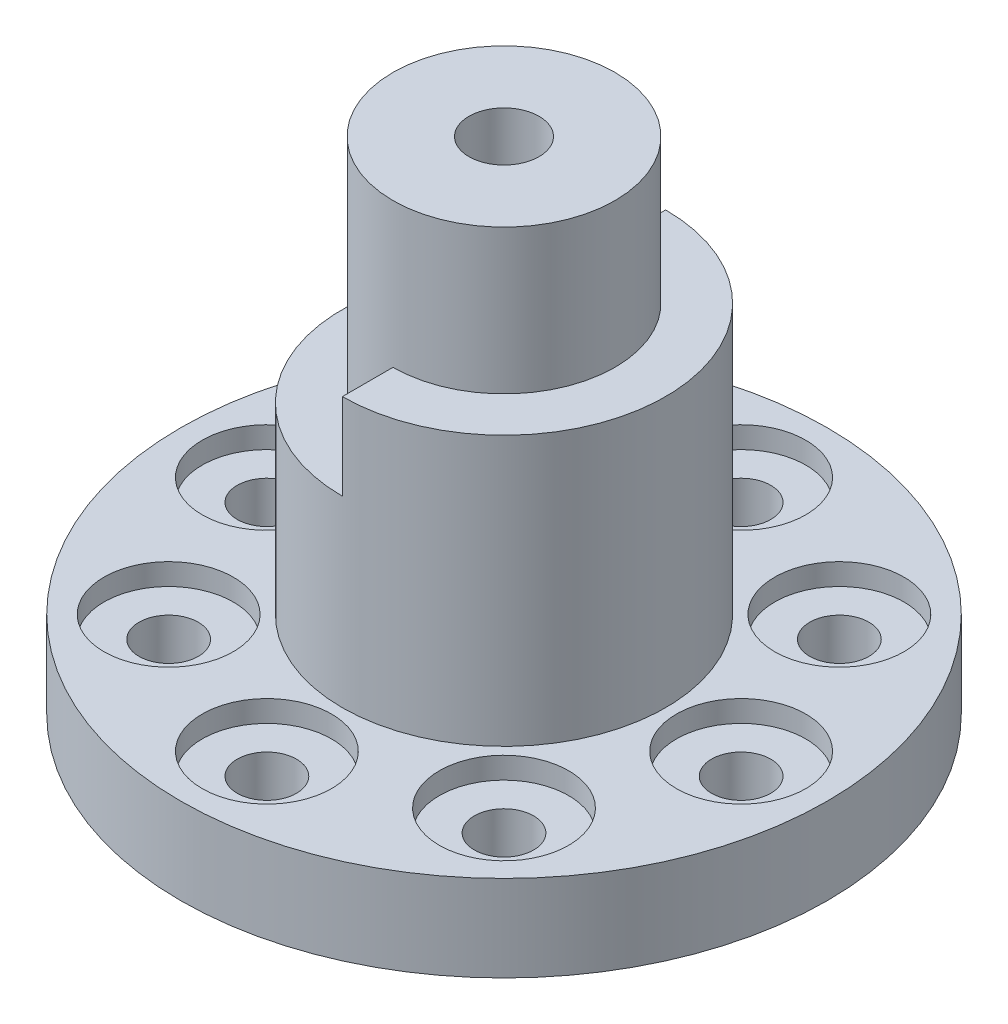
ISO-10303-21;
HEADER;
FILE_DESCRIPTION(('STEP AP214'),'2;1');
FILE_NAME('part.step','',(''),(''),'','','');
FILE_SCHEMA(('AUTOMOTIVE_DESIGN { 1 0 10303 214 1 1 1 1 }'));
ENDSEC;
DATA;
#1=APPLICATION_CONTEXT('core data for automotive mechanical design processes');
#2=APPLICATION_PROTOCOL_DEFINITION('international standard','automotive_design',2000,#1);
#3=PRODUCT_CONTEXT('',#1,'mechanical');
#4=PRODUCT('Part','Part','',(#3));
#5=PRODUCT_RELATED_PRODUCT_CATEGORY('part','',(#4));
#6=PRODUCT_DEFINITION_FORMATION('','',#4);
#7=PRODUCT_DEFINITION_CONTEXT('part definition',#1,'design');
#8=PRODUCT_DEFINITION('design','',#6,#7);
#9=PRODUCT_DEFINITION_SHAPE('','',#8);
#10=(LENGTH_UNIT() NAMED_UNIT(*) SI_UNIT(.MILLI.,.METRE.));
#11=(NAMED_UNIT(*) PLANE_ANGLE_UNIT() SI_UNIT($,.RADIAN.));
#12=(NAMED_UNIT(*) SI_UNIT($,.STERADIAN.) SOLID_ANGLE_UNIT());
#13=UNCERTAINTY_MEASURE_WITH_UNIT(LENGTH_MEASURE(1.E-05),#10,'distance_accuracy_value','');
#14=(GEOMETRIC_REPRESENTATION_CONTEXT(3) GLOBAL_UNCERTAINTY_ASSIGNED_CONTEXT((#13)) GLOBAL_UNIT_ASSIGNED_CONTEXT((#10,
#11,#12)) REPRESENTATION_CONTEXT('',''));
#15=CARTESIAN_POINT('',(0.,0.,0.));
#16=DIRECTION('',(0.,0.,1.));
#17=DIRECTION('',(1.,0.,0.));
#18=AXIS2_PLACEMENT_3D('',#15,#16,#17);
#19=CARTESIAN_POINT('',(0.,5.,0.));
#20=DIRECTION('',(0.,1.,0.));
#21=DIRECTION('',(0.,0.,1.));
#22=AXIS2_PLACEMENT_3D('',#19,#20,#21);
#23=PLANE('',#22);
#24=DIRECTION('',(0.,0.,1.));
#25=VECTOR('',#24,1.);
#26=CARTESIAN_POINT('',(0.,5.,0.));
#27=LINE('',#26,#25);
#28=CARTESIAN_POINT('',(0.,5.,-7.5));
#29=VERTEX_POINT('',#28);
#30=CARTESIAN_POINT('',(0.,5.,-5.15));
#31=VERTEX_POINT('',#30);
#32=EDGE_CURVE('E233',#29,#31,#27,.T.);
#33=ORIENTED_EDGE('',*,*,#32,.F.);
#34=CARTESIAN_POINT('',(0.,5.,0.));
#35=DIRECTION('',(0.,1.,0.));
#36=DIRECTION('',(0.,0.,1.));
#37=AXIS2_PLACEMENT_3D('',#34,#35,#36);
#38=CIRCLE('',#37,7.5);
#39=CARTESIAN_POINT('',(0.,5.,7.5));
#40=VERTEX_POINT('',#39);
#41=EDGE_CURVE('E105',#29,#40,#38,.T.);
#42=ORIENTED_EDGE('',*,*,#41,.T.);
#43=CARTESIAN_POINT('',(0.,5.,5.15));
#44=VERTEX_POINT('',#43);
#45=EDGE_CURVE('E58',#44,#40,#27,.T.);
#46=ORIENTED_EDGE('',*,*,#45,.F.);
#47=CARTESIAN_POINT('',(0.,5.,0.));
#48=DIRECTION('',(0.,1.,0.));
#49=DIRECTION('',(0.,0.,1.));
#50=AXIS2_PLACEMENT_3D('',#47,#48,#49);
#51=CIRCLE('',#50,5.15);
#52=EDGE_CURVE('E11',#44,#31,#51,.F.);
#53=ORIENTED_EDGE('',*,*,#52,.T.);
#54=EDGE_LOOP('',(#33,#42,#46,#53));
#55=FACE_BOUND('',#54,.T.);
#56=ADVANCED_FACE('F41',(#55),#23,.T.);
#57=CARTESIAN_POINT('',(0.,9.,0.));
#58=DIRECTION('',(1.,0.,0.));
#59=DIRECTION('',(0.,0.,-1.));
#60=AXIS2_PLACEMENT_3D('',#57,#58,#59);
#61=PLANE('',#60);
#62=DIRECTION('',(0.,0.,1.));
#63=VECTOR('',#62,1.);
#64=CARTESIAN_POINT('',(0.,9.,0.));
#65=LINE('',#64,#63);
#66=CARTESIAN_POINT('',(0.,9.,-7.5));
#67=VERTEX_POINT('',#66);
#68=CARTESIAN_POINT('',(0.,9.,-5.15));
#69=VERTEX_POINT('',#68);
#70=EDGE_CURVE('E66',#67,#69,#65,.T.);
#71=ORIENTED_EDGE('',*,*,#70,.F.);
#72=DIRECTION('',(0.,-1.,0.));
#73=VECTOR('',#72,1.);
#74=CARTESIAN_POINT('',(0.,9.,-7.5));
#75=LINE('',#74,#73);
#76=EDGE_CURVE('E86',#67,#29,#75,.T.);
#77=ORIENTED_EDGE('',*,*,#76,.T.);
#78=ORIENTED_EDGE('',*,*,#32,.T.);
#79=DIRECTION('',(0.,-1.,0.));
#80=VECTOR('',#79,1.);
#81=CARTESIAN_POINT('',(0.,9.,-5.15));
#82=LINE('',#81,#80);
#83=EDGE_CURVE('E88',#69,#31,#82,.T.);
#84=ORIENTED_EDGE('',*,*,#83,.F.);
#85=EDGE_LOOP('',(#71,#77,#78,#84));
#86=FACE_BOUND('',#85,.T.);
#87=ADVANCED_FACE('F84',(#86),#61,.F.);
#88=ORIENTED_EDGE('',*,*,#45,.T.);
#89=DIRECTION('',(0.,-1.,0.));
#90=VECTOR('',#89,1.);
#91=CARTESIAN_POINT('',(0.,9.,7.5));
#92=LINE('',#91,#90);
#93=CARTESIAN_POINT('',(0.,9.,7.5));
#94=VERTEX_POINT('',#93);
#95=EDGE_CURVE('E101',#94,#40,#92,.T.);
#96=ORIENTED_EDGE('',*,*,#95,.F.);
#97=CARTESIAN_POINT('',(0.,9.,5.15));
#98=VERTEX_POINT('',#97);
#99=EDGE_CURVE('E93',#98,#94,#65,.T.);
#100=ORIENTED_EDGE('',*,*,#99,.F.);
#101=DIRECTION('',(0.,-1.,0.));
#102=VECTOR('',#101,1.);
#103=CARTESIAN_POINT('',(0.,9.,5.15));
#104=LINE('',#103,#102);
#105=EDGE_CURVE('E237',#98,#44,#104,.T.);
#106=ORIENTED_EDGE('',*,*,#105,.T.);
#107=EDGE_LOOP('',(#88,#96,#100,#106));
#108=FACE_BOUND('',#107,.T.);
#109=ADVANCED_FACE('F331',(#108),#61,.F.);
#110=CARTESIAN_POINT('',(0.,9.,0.));
#111=DIRECTION('',(0.,1.,0.));
#112=DIRECTION('',(0.,0.,1.));
#113=AXIS2_PLACEMENT_3D('',#110,#111,#112);
#114=PLANE('',#113);
#115=ORIENTED_EDGE('',*,*,#99,.T.);
#116=CARTESIAN_POINT('',(0.,9.,0.));
#117=DIRECTION('',(0.,1.,0.));
#118=DIRECTION('',(0.,0.,1.));
#119=AXIS2_PLACEMENT_3D('',#116,#117,#118);
#120=CIRCLE('',#119,7.5);
#121=EDGE_CURVE('E95',#94,#67,#120,.T.);
#122=ORIENTED_EDGE('',*,*,#121,.T.);
#123=ORIENTED_EDGE('',*,*,#70,.T.);
#124=CARTESIAN_POINT('',(0.,9.,0.));
#125=DIRECTION('',(0.,1.,0.));
#126=DIRECTION('',(0.,0.,1.));
#127=AXIS2_PLACEMENT_3D('',#124,#125,#126);
#128=CIRCLE('',#127,5.15);
#129=EDGE_CURVE('E91',#69,#98,#128,.F.);
#130=ORIENTED_EDGE('',*,*,#129,.T.);
#131=EDGE_LOOP('',(#115,#122,#123,#130));
#132=FACE_BOUND('',#131,.T.);
#133=ADVANCED_FACE('F96',(#132),#114,.T.);
#134=CARTESIAN_POINT('',(-7.77817459305212,-7.5,-7.77817459305193));
#135=DIRECTION('',(0.,1.,0.));
#136=DIRECTION('',(0.,0.,1.));
#137=AXIS2_PLACEMENT_3D('',#134,#135,#136);
#138=CYLINDRICAL_SURFACE('',#137,1.375);
#139=CARTESIAN_POINT('',(-7.77817459305212,-7.5,-7.77817459305193));
#140=DIRECTION('',(0.,-1.,0.));
#141=DIRECTION('',(0.,0.,-1.));
#142=AXIS2_PLACEMENT_3D('',#139,#140,#141);
#143=CIRCLE('',#142,1.375);
#144=CARTESIAN_POINT('',(-7.77817459305212,-7.5,-9.15317459305193));
#145=VERTEX_POINT('',#144);
#146=EDGE_CURVE('E211',#145,#145,#143,.T.);
#147=ORIENTED_EDGE('',*,*,#146,.T.);
#148=EDGE_LOOP('',(#147));
#149=FACE_BOUND('',#148,.T.);
#150=CARTESIAN_POINT('',(-7.77817459305212,-4.5,-7.77817459305193));
#151=DIRECTION('',(0.,1.,0.));
#152=DIRECTION('',(0.,0.,1.));
#153=AXIS2_PLACEMENT_3D('',#150,#151,#152);
#154=CIRCLE('',#153,1.375);
#155=CARTESIAN_POINT('',(-7.77817459305212,-4.5,-6.40317459305193));
#156=VERTEX_POINT('',#155);
#157=EDGE_CURVE('E44',#156,#156,#154,.T.);
#158=ORIENTED_EDGE('',*,*,#157,.T.);
#159=EDGE_LOOP('',(#158));
#160=FACE_BOUND('',#159,.T.);
#161=ADVANCED_FACE('F282',(#149,#160),#138,.F.);
#162=CARTESIAN_POINT('',(-11.,-7.5,0.));
#163=DIRECTION('',(0.,1.,0.));
#164=DIRECTION('',(0.,0.,1.));
#165=AXIS2_PLACEMENT_3D('',#162,#163,#164);
#166=CYLINDRICAL_SURFACE('',#165,1.375);
#167=CARTESIAN_POINT('',(-11.,-7.5,0.));
#168=DIRECTION('',(0.,-1.,0.));
#169=DIRECTION('',(0.,0.,-1.));
#170=AXIS2_PLACEMENT_3D('',#167,#168,#169);
#171=CIRCLE('',#170,1.375);
#172=CARTESIAN_POINT('',(-11.,-7.5,-1.375));
#173=VERTEX_POINT('',#172);
#174=EDGE_CURVE('E207',#173,#173,#171,.T.);
#175=ORIENTED_EDGE('',*,*,#174,.T.);
#176=EDGE_LOOP('',(#175));
#177=FACE_BOUND('',#176,.T.);
#178=CARTESIAN_POINT('',(-11.,-4.5,0.));
#179=DIRECTION('',(0.,1.,0.));
#180=DIRECTION('',(0.,0.,1.));
#181=AXIS2_PLACEMENT_3D('',#178,#179,#180);
#182=CIRCLE('',#181,1.375);
#183=CARTESIAN_POINT('',(-11.,-4.5,1.375));
#184=VERTEX_POINT('',#183);
#185=EDGE_CURVE('E273',#184,#184,#182,.T.);
#186=ORIENTED_EDGE('',*,*,#185,.T.);
#187=EDGE_LOOP('',(#186));
#188=FACE_BOUND('',#187,.T.);
#189=ADVANCED_FACE('F389',(#177,#188),#166,.F.);
#190=CARTESIAN_POINT('',(-7.77817459305201,-7.5,7.77817459305203));
#191=DIRECTION('',(0.,1.,0.));
#192=DIRECTION('',(0.,0.,1.));
#193=AXIS2_PLACEMENT_3D('',#190,#191,#192);
#194=CYLINDRICAL_SURFACE('',#193,1.375);
#195=CARTESIAN_POINT('',(-7.77817459305201,-7.5,7.77817459305203));
#196=DIRECTION('',(0.,-1.,0.));
#197=DIRECTION('',(0.,0.,-1.));
#198=AXIS2_PLACEMENT_3D('',#195,#196,#197);
#199=CIRCLE('',#198,1.375);
#200=CARTESIAN_POINT('',(-7.77817459305201,-7.5,6.40317459305204));
#201=VERTEX_POINT('',#200);
#202=EDGE_CURVE('E203',#201,#201,#199,.T.);
#203=ORIENTED_EDGE('',*,*,#202,.T.);
#204=EDGE_LOOP('',(#203));
#205=FACE_BOUND('',#204,.T.);
#206=CARTESIAN_POINT('',(-7.77817459305201,-4.5,7.77817459305203));
#207=DIRECTION('',(0.,1.,0.));
#208=DIRECTION('',(0.,0.,1.));
#209=AXIS2_PLACEMENT_3D('',#206,#207,#208);
#210=CIRCLE('',#209,1.375);
#211=CARTESIAN_POINT('',(-7.77817459305201,-4.5,9.15317459305203));
#212=VERTEX_POINT('',#211);
#213=EDGE_CURVE('E270',#212,#212,#210,.T.);
#214=ORIENTED_EDGE('',*,*,#213,.T.);
#215=EDGE_LOOP('',(#214));
#216=FACE_BOUND('',#215,.T.);
#217=ADVANCED_FACE('F385',(#205,#216),#194,.F.);
#218=CARTESIAN_POINT('',(0.,-7.5,11.));
#219=DIRECTION('',(0.,1.,0.));
#220=DIRECTION('',(0.,0.,1.));
#221=AXIS2_PLACEMENT_3D('',#218,#219,#220);
#222=CYLINDRICAL_SURFACE('',#221,1.375);
#223=CARTESIAN_POINT('',(0.,-7.5,11.));
#224=DIRECTION('',(0.,-1.,0.));
#225=DIRECTION('',(0.,0.,-1.));
#226=AXIS2_PLACEMENT_3D('',#223,#224,#225);
#227=CIRCLE('',#226,1.375);
#228=CARTESIAN_POINT('',(0.,-7.5,9.625));
#229=VERTEX_POINT('',#228);
#230=EDGE_CURVE('E199',#229,#229,#227,.T.);
#231=ORIENTED_EDGE('',*,*,#230,.T.);
#232=EDGE_LOOP('',(#231));
#233=FACE_BOUND('',#232,.T.);
#234=CARTESIAN_POINT('',(0.,-4.5,11.));
#235=DIRECTION('',(0.,1.,0.));
#236=DIRECTION('',(0.,0.,1.));
#237=AXIS2_PLACEMENT_3D('',#234,#235,#236);
#238=CIRCLE('',#237,1.375);
#239=CARTESIAN_POINT('',(0.,-4.5,12.375));
#240=VERTEX_POINT('',#239);
#241=EDGE_CURVE('E266',#240,#240,#238,.T.);
#242=ORIENTED_EDGE('',*,*,#241,.T.);
#243=EDGE_LOOP('',(#242));
#244=FACE_BOUND('',#243,.T.);
#245=ADVANCED_FACE('F381',(#233,#244),#222,.F.);
#246=CARTESIAN_POINT('',(7.77817459305206,-7.5,7.77817459305199));
#247=DIRECTION('',(0.,1.,0.));
#248=DIRECTION('',(0.,0.,1.));
#249=AXIS2_PLACEMENT_3D('',#246,#247,#248);
#250=CYLINDRICAL_SURFACE('',#249,1.375);
#251=CARTESIAN_POINT('',(7.77817459305206,-7.5,7.77817459305199));
#252=DIRECTION('',(0.,-1.,0.));
#253=DIRECTION('',(0.,0.,-1.));
#254=AXIS2_PLACEMENT_3D('',#251,#252,#253);
#255=CIRCLE('',#254,1.375);
#256=CARTESIAN_POINT('',(7.77817459305206,-7.5,6.40317459305199));
#257=VERTEX_POINT('',#256);
#258=EDGE_CURVE('E195',#257,#257,#255,.T.);
#259=ORIENTED_EDGE('',*,*,#258,.T.);
#260=EDGE_LOOP('',(#259));
#261=FACE_BOUND('',#260,.T.);
#262=CARTESIAN_POINT('',(7.77817459305206,-4.5,7.77817459305199));
#263=DIRECTION('',(0.,1.,0.));
#264=DIRECTION('',(0.,0.,1.));
#265=AXIS2_PLACEMENT_3D('',#262,#263,#264);
#266=CIRCLE('',#265,1.375);
#267=CARTESIAN_POINT('',(7.77817459305206,-4.5,9.15317459305198));
#268=VERTEX_POINT('',#267);
#269=EDGE_CURVE('E262',#268,#268,#266,.T.);
#270=ORIENTED_EDGE('',*,*,#269,.T.);
#271=EDGE_LOOP('',(#270));
#272=FACE_BOUND('',#271,.T.);
#273=ADVANCED_FACE('F377',(#261,#272),#250,.F.);
#274=CARTESIAN_POINT('',(11.,-7.5,0.));
#275=DIRECTION('',(0.,1.,0.));
#276=DIRECTION('',(0.,0.,1.));
#277=AXIS2_PLACEMENT_3D('',#274,#275,#276);
#278=CYLINDRICAL_SURFACE('',#277,1.375);
#279=CARTESIAN_POINT('',(11.,-7.5,0.));
#280=DIRECTION('',(0.,-1.,0.));
#281=DIRECTION('',(0.,0.,-1.));
#282=AXIS2_PLACEMENT_3D('',#279,#280,#281);
#283=CIRCLE('',#282,1.375);
#284=CARTESIAN_POINT('',(11.,-7.5,-1.37500000000008));
#285=VERTEX_POINT('',#284);
#286=EDGE_CURVE('E191',#285,#285,#283,.T.);
#287=ORIENTED_EDGE('',*,*,#286,.T.);
#288=EDGE_LOOP('',(#287));
#289=FACE_BOUND('',#288,.T.);
#290=CARTESIAN_POINT('',(11.,-4.5,0.));
#291=DIRECTION('',(0.,1.,0.));
#292=DIRECTION('',(0.,0.,1.));
#293=AXIS2_PLACEMENT_3D('',#290,#291,#292);
#294=CIRCLE('',#293,1.375);
#295=CARTESIAN_POINT('',(11.,-4.5,1.37499999999992));
#296=VERTEX_POINT('',#295);
#297=EDGE_CURVE('E258',#296,#296,#294,.T.);
#298=ORIENTED_EDGE('',*,*,#297,.T.);
#299=EDGE_LOOP('',(#298));
#300=FACE_BOUND('',#299,.T.);
#301=ADVANCED_FACE('F373',(#289,#300),#278,.F.);
#302=CARTESIAN_POINT('',(7.77817459305195,-7.5,-7.77817459305209));
#303=DIRECTION('',(0.,1.,0.));
#304=DIRECTION('',(0.,0.,1.));
#305=AXIS2_PLACEMENT_3D('',#302,#303,#304);
#306=CYLINDRICAL_SURFACE('',#305,1.375);
#307=CARTESIAN_POINT('',(7.77817459305195,-7.5,-7.77817459305209));
#308=DIRECTION('',(0.,-1.,0.));
#309=DIRECTION('',(0.,0.,-1.));
#310=AXIS2_PLACEMENT_3D('',#307,#308,#309);
#311=CIRCLE('',#310,1.375);
#312=CARTESIAN_POINT('',(7.77817459305195,-7.5,-9.15317459305209));
#313=VERTEX_POINT('',#312);
#314=EDGE_CURVE('E186',#313,#313,#311,.T.);
#315=ORIENTED_EDGE('',*,*,#314,.T.);
#316=EDGE_LOOP('',(#315));
#317=FACE_BOUND('',#316,.T.);
#318=CARTESIAN_POINT('',(7.77817459305195,-4.5,-7.77817459305209));
#319=DIRECTION('',(0.,1.,0.));
#320=DIRECTION('',(0.,0.,1.));
#321=AXIS2_PLACEMENT_3D('',#318,#319,#320);
#322=CIRCLE('',#321,1.375);
#323=CARTESIAN_POINT('',(7.77817459305195,-4.5,-6.40317459305209));
#324=VERTEX_POINT('',#323);
#325=EDGE_CURVE('E254',#324,#324,#322,.T.);
#326=ORIENTED_EDGE('',*,*,#325,.T.);
#327=EDGE_LOOP('',(#326));
#328=FACE_BOUND('',#327,.T.);
#329=ADVANCED_FACE('F364',(#317,#328),#306,.F.);
#330=CARTESIAN_POINT('',(-1.15218884181823E-13,-7.5,-11.));
#331=DIRECTION('',(0.,1.,0.));
#332=DIRECTION('',(0.,0.,1.));
#333=AXIS2_PLACEMENT_3D('',#330,#331,#332);
#334=CYLINDRICAL_SURFACE('',#333,1.375);
#335=CARTESIAN_POINT('',(-1.15218884181823E-13,-7.5,-11.));
#336=DIRECTION('',(0.,-1.,0.));
#337=DIRECTION('',(0.,0.,-1.));
#338=AXIS2_PLACEMENT_3D('',#335,#336,#337);
#339=CIRCLE('',#338,1.375);
#340=CARTESIAN_POINT('',(-1.15218884181823E-13,-7.5,-12.375));
#341=VERTEX_POINT('',#340);
#342=EDGE_CURVE('E182',#341,#341,#339,.T.);
#343=ORIENTED_EDGE('',*,*,#342,.T.);
#344=EDGE_LOOP('',(#343));
#345=FACE_BOUND('',#344,.T.);
#346=CARTESIAN_POINT('',(-1.15218884181823E-13,-4.5,-11.));
#347=DIRECTION('',(0.,1.,0.));
#348=DIRECTION('',(0.,0.,1.));
#349=AXIS2_PLACEMENT_3D('',#346,#347,#348);
#350=CIRCLE('',#349,1.375);
#351=CARTESIAN_POINT('',(-1.15218884181823E-13,-4.5,-9.625));
#352=VERTEX_POINT('',#351);
#353=EDGE_CURVE('E178',#352,#352,#350,.T.);
#354=ORIENTED_EDGE('',*,*,#353,.T.);
#355=EDGE_LOOP('',(#354));
#356=FACE_BOUND('',#355,.T.);
#357=ADVANCED_FACE('F355',(#345,#356),#334,.F.);
#358=CARTESIAN_POINT('',(0.,37.,0.));
#359=DIRECTION('',(0.,-1.,0.));
#360=DIRECTION('',(0.,0.,-1.));
#361=AXIS2_PLACEMENT_3D('',#358,#359,#360);
#362=CYLINDRICAL_SURFACE('',#361,1.625);
#363=CARTESIAN_POINT('',(0.,15.7,0.));
#364=DIRECTION('',(0.,1.,0.));
#365=DIRECTION('',(0.,0.,1.));
#366=AXIS2_PLACEMENT_3D('',#363,#364,#365);
#367=CIRCLE('',#366,1.625);
#368=CARTESIAN_POINT('',(0.,15.7,1.625));
#369=VERTEX_POINT('',#368);
#370=EDGE_CURVE('E236',#369,#369,#367,.T.);
#371=ORIENTED_EDGE('',*,*,#370,.T.);
#372=EDGE_LOOP('',(#371));
#373=FACE_BOUND('',#372,.T.);
#374=CARTESIAN_POINT('',(0.,10.7,0.));
#375=DIRECTION('',(0.,-1.,0.));
#376=DIRECTION('',(0.,0.,-1.));
#377=AXIS2_PLACEMENT_3D('',#374,#375,#376);
#378=CIRCLE('',#377,1.625);
#379=CARTESIAN_POINT('',(0.,10.7,-1.625));
#380=VERTEX_POINT('',#379);
#381=EDGE_CURVE('E229',#380,#380,#378,.F.);
#382=ORIENTED_EDGE('',*,*,#381,.F.);
#383=EDGE_LOOP('',(#382));
#384=FACE_BOUND('',#383,.T.);
#385=ADVANCED_FACE('F350',(#373,#384),#362,.F.);
#386=CARTESIAN_POINT('',(0.,15.7,0.));
#387=DIRECTION('',(0.,-1.,0.));
#388=DIRECTION('',(0.,0.,-1.));
#389=AXIS2_PLACEMENT_3D('',#386,#387,#388);
#390=CYLINDRICAL_SURFACE('',#389,5.15);
#391=CARTESIAN_POINT('',(0.,15.7,0.));
#392=DIRECTION('',(0.,1.,0.));
#393=DIRECTION('',(0.,0.,1.));
#394=AXIS2_PLACEMENT_3D('',#391,#392,#393);
#395=CIRCLE('',#394,5.15);
#396=CARTESIAN_POINT('',(0.,15.7,5.15));
#397=VERTEX_POINT('',#396);
#398=EDGE_CURVE('E50',#397,#397,#395,.T.);
#399=ORIENTED_EDGE('',*,*,#398,.F.);
#400=EDGE_LOOP('',(#399));
#401=FACE_BOUND('',#400,.T.);
#402=ORIENTED_EDGE('',*,*,#83,.T.);
#403=ORIENTED_EDGE('',*,*,#52,.F.);
#404=ORIENTED_EDGE('',*,*,#105,.F.);
#405=ORIENTED_EDGE('',*,*,#129,.F.);
#406=EDGE_LOOP('',(#402,#403,#404,#405));
#407=FACE_BOUND('',#406,.T.);
#408=ADVANCED_FACE('F335',(#401,#407),#390,.T.);
#409=CARTESIAN_POINT('',(0.,15.7,0.));
#410=DIRECTION('',(0.,1.,0.));
#411=DIRECTION('',(0.,0.,1.));
#412=AXIS2_PLACEMENT_3D('',#409,#410,#411);
#413=PLANE('',#412);
#414=ORIENTED_EDGE('',*,*,#370,.F.);
#415=EDGE_LOOP('',(#414));
#416=FACE_BOUND('',#415,.T.);
#417=ORIENTED_EDGE('',*,*,#398,.T.);
#418=EDGE_LOOP('',(#417));
#419=FACE_BOUND('',#418,.T.);
#420=ADVANCED_FACE('F346',(#416,#419),#413,.T.);
#421=CARTESIAN_POINT('',(0.,10.7,0.));
#422=DIRECTION('',(0.,-1.,0.));
#423=DIRECTION('',(0.,0.,-1.));
#424=AXIS2_PLACEMENT_3D('',#421,#422,#423);
#425=PLANE('',#424);
#426=CARTESIAN_POINT('',(0.,10.7,0.));
#427=DIRECTION('',(0.,-1.,0.));
#428=DIRECTION('',(0.,0.,-1.));
#429=AXIS2_PLACEMENT_3D('',#426,#427,#428);
#430=CIRCLE('',#429,3.5);
#431=CARTESIAN_POINT('',(0.,10.7,-3.5));
#432=VERTEX_POINT('',#431);
#433=EDGE_CURVE('E223',#432,#432,#430,.T.);
#434=ORIENTED_EDGE('',*,*,#433,.T.);
#435=EDGE_LOOP('',(#434));
#436=FACE_BOUND('',#435,.T.);
#437=ORIENTED_EDGE('',*,*,#381,.T.);
#438=EDGE_LOOP('',(#437));
#439=FACE_BOUND('',#438,.T.);
#440=ADVANCED_FACE('F320',(#436,#439),#425,.T.);
#441=CARTESIAN_POINT('',(0.,10.7,0.));
#442=DIRECTION('',(0.,-1.,0.));
#443=DIRECTION('',(0.,0.,-1.));
#444=AXIS2_PLACEMENT_3D('',#441,#442,#443);
#445=CYLINDRICAL_SURFACE('',#444,3.5);
#446=ORIENTED_EDGE('',*,*,#433,.F.);
#447=EDGE_LOOP('',(#446));
#448=FACE_BOUND('',#447,.T.);
#449=CARTESIAN_POINT('',(0.,-7.5,0.));
#450=DIRECTION('',(0.,-1.,0.));
#451=DIRECTION('',(0.,0.,-1.));
#452=AXIS2_PLACEMENT_3D('',#449,#450,#451);
#453=CIRCLE('',#452,3.5);
#454=CARTESIAN_POINT('',(0.,-7.5,-3.5));
#455=VERTEX_POINT('',#454);
#456=EDGE_CURVE('E215',#455,#455,#453,.F.);
#457=ORIENTED_EDGE('',*,*,#456,.F.);
#458=EDGE_LOOP('',(#457));
#459=FACE_BOUND('',#458,.T.);
#460=ADVANCED_FACE('F311',(#448,#459),#445,.F.);
#461=CARTESIAN_POINT('',(0.,-7.5,0.));
#462=DIRECTION('',(0.,1.,0.));
#463=DIRECTION('',(0.,0.,1.));
#464=AXIS2_PLACEMENT_3D('',#461,#462,#463);
#465=CYLINDRICAL_SURFACE('',#464,15.);
#466=CARTESIAN_POINT('',(0.,-7.5,0.));
#467=DIRECTION('',(0.,-1.,0.));
#468=DIRECTION('',(0.,0.,-1.));
#469=AXIS2_PLACEMENT_3D('',#466,#467,#468);
#470=CIRCLE('',#469,15.);
#471=CARTESIAN_POINT('',(0.,-7.5,-15.));
#472=VERTEX_POINT('',#471);
#473=EDGE_CURVE('E219',#472,#472,#470,.T.);
#474=ORIENTED_EDGE('',*,*,#473,.F.);
#475=EDGE_LOOP('',(#474));
#476=FACE_BOUND('',#475,.T.);
#477=CARTESIAN_POINT('',(0.,-3.5,0.));
#478=DIRECTION('',(0.,-1.,0.));
#479=DIRECTION('',(0.,0.,-1.));
#480=AXIS2_PLACEMENT_3D('',#477,#478,#479);
#481=CIRCLE('',#480,15.);
#482=CARTESIAN_POINT('',(0.,-3.5,-15.));
#483=VERTEX_POINT('',#482);
#484=EDGE_CURVE('E187',#483,#483,#481,.T.);
#485=ORIENTED_EDGE('',*,*,#484,.T.);
#486=EDGE_LOOP('',(#485));
#487=FACE_BOUND('',#486,.T.);
#488=ADVANCED_FACE('F309',(#476,#487),#465,.T.);
#489=CARTESIAN_POINT('',(0.,-7.5,0.));
#490=DIRECTION('',(0.,-1.,0.));
#491=DIRECTION('',(0.,0.,-1.));
#492=AXIS2_PLACEMENT_3D('',#489,#490,#491);
#493=PLANE('',#492);
#494=ORIENTED_EDGE('',*,*,#342,.F.);
#495=EDGE_LOOP('',(#494));
#496=FACE_BOUND('',#495,.T.);
#497=ORIENTED_EDGE('',*,*,#314,.F.);
#498=EDGE_LOOP('',(#497));
#499=FACE_BOUND('',#498,.T.);
#500=ORIENTED_EDGE('',*,*,#286,.F.);
#501=EDGE_LOOP('',(#500));
#502=FACE_BOUND('',#501,.T.);
#503=ORIENTED_EDGE('',*,*,#258,.F.);
#504=EDGE_LOOP('',(#503));
#505=FACE_BOUND('',#504,.T.);
#506=ORIENTED_EDGE('',*,*,#230,.F.);
#507=EDGE_LOOP('',(#506));
#508=FACE_BOUND('',#507,.T.);
#509=ORIENTED_EDGE('',*,*,#202,.F.);
#510=EDGE_LOOP('',(#509));
#511=FACE_BOUND('',#510,.T.);
#512=ORIENTED_EDGE('',*,*,#174,.F.);
#513=EDGE_LOOP('',(#512));
#514=FACE_BOUND('',#513,.T.);
#515=ORIENTED_EDGE('',*,*,#146,.F.);
#516=EDGE_LOOP('',(#515));
#517=FACE_BOUND('',#516,.T.);
#518=ORIENTED_EDGE('',*,*,#456,.T.);
#519=EDGE_LOOP('',(#518));
#520=FACE_BOUND('',#519,.T.);
#521=ORIENTED_EDGE('',*,*,#473,.T.);
#522=EDGE_LOOP('',(#521));
#523=FACE_BOUND('',#522,.T.);
#524=ADVANCED_FACE('F302',(#496,#499,#502,#505,#508,#511,#514,#517,#520,#523),#493,.T.);
#525=CARTESIAN_POINT('',(0.,-3.5,0.));
#526=DIRECTION('',(0.,-1.,0.));
#527=DIRECTION('',(0.,0.,-1.));
#528=AXIS2_PLACEMENT_3D('',#525,#526,#527);
#529=PLANE('',#528);
#530=CARTESIAN_POINT('',(0.,-3.5,0.));
#531=DIRECTION('',(0.,1.,0.));
#532=DIRECTION('',(0.,0.,1.));
#533=AXIS2_PLACEMENT_3D('',#530,#531,#532);
#534=CIRCLE('',#533,7.5);
#535=CARTESIAN_POINT('',(0.,-3.5,7.5));
#536=VERTEX_POINT('',#535);
#537=EDGE_CURVE('E110',#536,#536,#534,.T.);
#538=ORIENTED_EDGE('',*,*,#537,.F.);
#539=EDGE_LOOP('',(#538));
#540=FACE_BOUND('',#539,.T.);
#541=CARTESIAN_POINT('',(-7.77817459305212,-3.5,7.77817459305193));
#542=DIRECTION('',(0.,1.,0.));
#543=DIRECTION('',(0.,0.,1.));
#544=AXIS2_PLACEMENT_3D('',#541,#542,#543);
#545=CIRCLE('',#544,3.);
#546=CARTESIAN_POINT('',(-7.77817459305212,-3.5,10.7781745930519));
#547=VERTEX_POINT('',#546);
#548=EDGE_CURVE('E116',#547,#547,#545,.T.);
#549=ORIENTED_EDGE('',*,*,#548,.F.);
#550=EDGE_LOOP('',(#549));
#551=FACE_BOUND('',#550,.T.);
#552=CARTESIAN_POINT('',(-1.15218884181823E-13,-3.5,11.));
#553=DIRECTION('',(0.,1.,0.));
#554=DIRECTION('',(0.,0.,1.));
#555=AXIS2_PLACEMENT_3D('',#552,#553,#554);
#556=CIRCLE('',#555,3.);
#557=CARTESIAN_POINT('',(-1.15218884181823E-13,-3.5,14.));
#558=VERTEX_POINT('',#557);
#559=EDGE_CURVE('E163',#558,#558,#556,.T.);
#560=ORIENTED_EDGE('',*,*,#559,.F.);
#561=EDGE_LOOP('',(#560));
#562=FACE_BOUND('',#561,.T.);
#563=CARTESIAN_POINT('',(7.77817459305195,-3.5,7.77817459305209));
#564=DIRECTION('',(0.,1.,0.));
#565=DIRECTION('',(0.,0.,1.));
#566=AXIS2_PLACEMENT_3D('',#563,#564,#565);
#567=CIRCLE('',#566,3.);
#568=CARTESIAN_POINT('',(7.77817459305195,-3.5,10.7781745930521));
#569=VERTEX_POINT('',#568);
#570=EDGE_CURVE('E155',#569,#569,#567,.T.);
#571=ORIENTED_EDGE('',*,*,#570,.F.);
#572=EDGE_LOOP('',(#571));
#573=FACE_BOUND('',#572,.T.);
#574=CARTESIAN_POINT('',(11.,-3.5,0.));
#575=DIRECTION('',(0.,1.,0.));
#576=DIRECTION('',(0.,0.,1.));
#577=AXIS2_PLACEMENT_3D('',#574,#575,#576);
#578=CIRCLE('',#577,3.);
#579=CARTESIAN_POINT('',(11.,-3.5,3.00000000000008));
#580=VERTEX_POINT('',#579);
#581=EDGE_CURVE('E147',#580,#580,#578,.T.);
#582=ORIENTED_EDGE('',*,*,#581,.F.);
#583=EDGE_LOOP('',(#582));
#584=FACE_BOUND('',#583,.T.);
#585=CARTESIAN_POINT('',(7.77817459305206,-3.5,-7.77817459305199));
#586=DIRECTION('',(0.,1.,0.));
#587=DIRECTION('',(0.,0.,1.));
#588=AXIS2_PLACEMENT_3D('',#585,#586,#587);
#589=CIRCLE('',#588,3.);
#590=CARTESIAN_POINT('',(7.77817459305206,-3.5,-4.77817459305199));
#591=VERTEX_POINT('',#590);
#592=EDGE_CURVE('E139',#591,#591,#589,.T.);
#593=ORIENTED_EDGE('',*,*,#592,.F.);
#594=EDGE_LOOP('',(#593));
#595=FACE_BOUND('',#594,.T.);
#596=CARTESIAN_POINT('',(0.,-3.5,-11.));
#597=DIRECTION('',(0.,1.,0.));
#598=DIRECTION('',(0.,0.,1.));
#599=AXIS2_PLACEMENT_3D('',#596,#597,#598);
#600=CIRCLE('',#599,3.);
#601=CARTESIAN_POINT('',(0.,-3.5,-8.));
#602=VERTEX_POINT('',#601);
#603=EDGE_CURVE('E131',#602,#602,#600,.T.);
#604=ORIENTED_EDGE('',*,*,#603,.F.);
#605=EDGE_LOOP('',(#604));
#606=FACE_BOUND('',#605,.T.);
#607=CARTESIAN_POINT('',(-7.77817459305201,-3.5,-7.77817459305203));
#608=DIRECTION('',(0.,1.,0.));
#609=DIRECTION('',(0.,0.,1.));
#610=AXIS2_PLACEMENT_3D('',#607,#608,#609);
#611=CIRCLE('',#610,3.);
#612=CARTESIAN_POINT('',(-7.77817459305201,-3.5,-4.77817459305204));
#613=VERTEX_POINT('',#612);
#614=EDGE_CURVE('E123',#613,#613,#611,.T.);
#615=ORIENTED_EDGE('',*,*,#614,.F.);
#616=EDGE_LOOP('',(#615));
#617=FACE_BOUND('',#616,.T.);
#618=CARTESIAN_POINT('',(-11.,-3.5,0.));
#619=DIRECTION('',(0.,1.,0.));
#620=DIRECTION('',(0.,0.,1.));
#621=AXIS2_PLACEMENT_3D('',#618,#619,#620);
#622=CIRCLE('',#621,3.);
#623=CARTESIAN_POINT('',(-11.,-3.5,3.));
#624=VERTEX_POINT('',#623);
#625=EDGE_CURVE('E122',#624,#624,#622,.T.);
#626=ORIENTED_EDGE('',*,*,#625,.F.);
#627=EDGE_LOOP('',(#626));
#628=FACE_BOUND('',#627,.T.);
#629=ORIENTED_EDGE('',*,*,#484,.F.);
#630=EDGE_LOOP('',(#629));
#631=FACE_BOUND('',#630,.T.);
#632=ADVANCED_FACE('F298',(#540,#551,#562,#573,#584,#595,#606,#617,#628,#631),#529,.F.);
#633=CARTESIAN_POINT('',(-11.,-4.5,0.));
#634=DIRECTION('',(0.,1.,0.));
#635=DIRECTION('',(0.,0.,1.));
#636=AXIS2_PLACEMENT_3D('',#633,#634,#635);
#637=CYLINDRICAL_SURFACE('',#636,3.);
#638=CARTESIAN_POINT('',(-11.,-4.5,0.));
#639=DIRECTION('',(0.,1.,0.));
#640=DIRECTION('',(0.,0.,1.));
#641=AXIS2_PLACEMENT_3D('',#638,#639,#640);
#642=CIRCLE('',#641,3.);
#643=CARTESIAN_POINT('',(-11.,-4.5,3.));
#644=VERTEX_POINT('',#643);
#645=EDGE_CURVE('E174',#644,#644,#642,.T.);
#646=ORIENTED_EDGE('',*,*,#645,.F.);
#647=EDGE_LOOP('',(#646));
#648=FACE_BOUND('',#647,.T.);
#649=ORIENTED_EDGE('',*,*,#625,.T.);
#650=EDGE_LOOP('',(#649));
#651=FACE_BOUND('',#650,.T.);
#652=ADVANCED_FACE('F301',(#648,#651),#637,.F.);
#653=CARTESIAN_POINT('',(-11.,-4.5,0.));
#654=DIRECTION('',(0.,1.,0.));
#655=DIRECTION('',(0.,0.,1.));
#656=AXIS2_PLACEMENT_3D('',#653,#654,#655);
#657=PLANE('',#656);
#658=ORIENTED_EDGE('',*,*,#185,.F.);
#659=EDGE_LOOP('',(#658));
#660=FACE_BOUND('',#659,.T.);
#661=ORIENTED_EDGE('',*,*,#645,.T.);
#662=EDGE_LOOP('',(#661));
#663=FACE_BOUND('',#662,.T.);
#664=ADVANCED_FACE('F294',(#660,#663),#657,.T.);
#665=CARTESIAN_POINT('',(-7.77817459305201,-4.5,-7.77817459305203));
#666=DIRECTION('',(0.,1.,0.));
#667=DIRECTION('',(0.,0.,1.));
#668=AXIS2_PLACEMENT_3D('',#665,#666,#667);
#669=CYLINDRICAL_SURFACE('',#668,3.);
#670=CARTESIAN_POINT('',(-7.77817459305201,-4.5,-7.77817459305203));
#671=DIRECTION('',(0.,1.,0.));
#672=DIRECTION('',(0.,0.,1.));
#673=AXIS2_PLACEMENT_3D('',#670,#671,#672);
#674=CIRCLE('',#673,3.);
#675=CARTESIAN_POINT('',(-7.77817459305201,-4.5,-4.77817459305204));
#676=VERTEX_POINT('',#675);
#677=EDGE_CURVE('E118',#676,#676,#674,.T.);
#678=ORIENTED_EDGE('',*,*,#677,.F.);
#679=EDGE_LOOP('',(#678));
#680=FACE_BOUND('',#679,.T.);
#681=ORIENTED_EDGE('',*,*,#614,.T.);
#682=EDGE_LOOP('',(#681));
#683=FACE_BOUND('',#682,.T.);
#684=ADVANCED_FACE('F288',(#680,#683),#669,.F.);
#685=CARTESIAN_POINT('',(-7.77817459305201,-4.5,-7.77817459305203));
#686=DIRECTION('',(0.,1.,0.));
#687=DIRECTION('',(0.,0.,1.));
#688=AXIS2_PLACEMENT_3D('',#685,#686,#687);
#689=PLANE('',#688);
#690=ORIENTED_EDGE('',*,*,#157,.F.);
#691=EDGE_LOOP('',(#690));
#692=FACE_BOUND('',#691,.T.);
#693=ORIENTED_EDGE('',*,*,#677,.T.);
#694=EDGE_LOOP('',(#693));
#695=FACE_BOUND('',#694,.T.);
#696=ADVANCED_FACE('F284',(#692,#695),#689,.T.);
#697=CARTESIAN_POINT('',(0.,-4.5,-11.));
#698=DIRECTION('',(0.,1.,0.));
#699=DIRECTION('',(0.,0.,1.));
#700=AXIS2_PLACEMENT_3D('',#697,#698,#699);
#701=CYLINDRICAL_SURFACE('',#700,3.);
#702=CARTESIAN_POINT('',(0.,-4.5,-11.));
#703=DIRECTION('',(0.,1.,0.));
#704=DIRECTION('',(0.,0.,1.));
#705=AXIS2_PLACEMENT_3D('',#702,#703,#704);
#706=CIRCLE('',#705,3.);
#707=CARTESIAN_POINT('',(0.,-4.5,-8.));
#708=VERTEX_POINT('',#707);
#709=EDGE_CURVE('E127',#708,#708,#706,.T.);
#710=ORIENTED_EDGE('',*,*,#709,.F.);
#711=EDGE_LOOP('',(#710));
#712=FACE_BOUND('',#711,.T.);
#713=ORIENTED_EDGE('',*,*,#603,.T.);
#714=EDGE_LOOP('',(#713));
#715=FACE_BOUND('',#714,.T.);
#716=ADVANCED_FACE('F287',(#712,#715),#701,.F.);
#717=CARTESIAN_POINT('',(0.,-4.5,-11.));
#718=DIRECTION('',(0.,1.,0.));
#719=DIRECTION('',(0.,0.,1.));
#720=AXIS2_PLACEMENT_3D('',#717,#718,#719);
#721=PLANE('',#720);
#722=ORIENTED_EDGE('',*,*,#353,.F.);
#723=EDGE_LOOP('',(#722));
#724=FACE_BOUND('',#723,.T.);
#725=ORIENTED_EDGE('',*,*,#709,.T.);
#726=EDGE_LOOP('',(#725));
#727=FACE_BOUND('',#726,.T.);
#728=ADVANCED_FACE('F483',(#724,#727),#721,.T.);
#729=CARTESIAN_POINT('',(7.77817459305206,-4.5,-7.77817459305199));
#730=DIRECTION('',(0.,1.,0.));
#731=DIRECTION('',(0.,0.,1.));
#732=AXIS2_PLACEMENT_3D('',#729,#730,#731);
#733=CYLINDRICAL_SURFACE('',#732,3.);
#734=CARTESIAN_POINT('',(7.77817459305206,-4.5,-7.77817459305199));
#735=DIRECTION('',(0.,1.,0.));
#736=DIRECTION('',(0.,0.,1.));
#737=AXIS2_PLACEMENT_3D('',#734,#735,#736);
#738=CIRCLE('',#737,3.);
#739=CARTESIAN_POINT('',(7.77817459305206,-4.5,-4.77817459305199));
#740=VERTEX_POINT('',#739);
#741=EDGE_CURVE('E135',#740,#740,#738,.T.);
#742=ORIENTED_EDGE('',*,*,#741,.F.);
#743=EDGE_LOOP('',(#742));
#744=FACE_BOUND('',#743,.T.);
#745=ORIENTED_EDGE('',*,*,#592,.T.);
#746=EDGE_LOOP('',(#745));
#747=FACE_BOUND('',#746,.T.);
#748=ADVANCED_FACE('F491',(#744,#747),#733,.F.);
#749=CARTESIAN_POINT('',(7.77817459305206,-4.5,-7.77817459305199));
#750=DIRECTION('',(0.,1.,0.));
#751=DIRECTION('',(0.,0.,1.));
#752=AXIS2_PLACEMENT_3D('',#749,#750,#751);
#753=PLANE('',#752);
#754=ORIENTED_EDGE('',*,*,#325,.F.);
#755=EDGE_LOOP('',(#754));
#756=FACE_BOUND('',#755,.T.);
#757=ORIENTED_EDGE('',*,*,#741,.T.);
#758=EDGE_LOOP('',(#757));
#759=FACE_BOUND('',#758,.T.);
#760=ADVANCED_FACE('F499',(#756,#759),#753,.T.);
#761=CARTESIAN_POINT('',(11.,-4.5,0.));
#762=DIRECTION('',(0.,1.,0.));
#763=DIRECTION('',(0.,0.,1.));
#764=AXIS2_PLACEMENT_3D('',#761,#762,#763);
#765=CYLINDRICAL_SURFACE('',#764,3.);
#766=CARTESIAN_POINT('',(11.,-4.5,0.));
#767=DIRECTION('',(0.,1.,0.));
#768=DIRECTION('',(0.,0.,1.));
#769=AXIS2_PLACEMENT_3D('',#766,#767,#768);
#770=CIRCLE('',#769,3.);
#771=CARTESIAN_POINT('',(11.,-4.5,3.00000000000008));
#772=VERTEX_POINT('',#771);
#773=EDGE_CURVE('E143',#772,#772,#770,.T.);
#774=ORIENTED_EDGE('',*,*,#773,.F.);
#775=EDGE_LOOP('',(#774));
#776=FACE_BOUND('',#775,.T.);
#777=ORIENTED_EDGE('',*,*,#581,.T.);
#778=EDGE_LOOP('',(#777));
#779=FACE_BOUND('',#778,.T.);
#780=ADVANCED_FACE('F507',(#776,#779),#765,.F.);
#781=CARTESIAN_POINT('',(11.,-4.5,0.));
#782=DIRECTION('',(0.,1.,0.));
#783=DIRECTION('',(0.,0.,1.));
#784=AXIS2_PLACEMENT_3D('',#781,#782,#783);
#785=PLANE('',#784);
#786=ORIENTED_EDGE('',*,*,#297,.F.);
#787=EDGE_LOOP('',(#786));
#788=FACE_BOUND('',#787,.T.);
#789=ORIENTED_EDGE('',*,*,#773,.T.);
#790=EDGE_LOOP('',(#789));
#791=FACE_BOUND('',#790,.T.);
#792=ADVANCED_FACE('F515',(#788,#791),#785,.T.);
#793=CARTESIAN_POINT('',(7.77817459305195,-4.5,7.77817459305209));
#794=DIRECTION('',(0.,1.,0.));
#795=DIRECTION('',(0.,0.,1.));
#796=AXIS2_PLACEMENT_3D('',#793,#794,#795);
#797=CYLINDRICAL_SURFACE('',#796,3.);
#798=CARTESIAN_POINT('',(7.77817459305195,-4.5,7.77817459305209));
#799=DIRECTION('',(0.,1.,0.));
#800=DIRECTION('',(0.,0.,1.));
#801=AXIS2_PLACEMENT_3D('',#798,#799,#800);
#802=CIRCLE('',#801,3.);
#803=CARTESIAN_POINT('',(7.77817459305195,-4.5,10.7781745930521));
#804=VERTEX_POINT('',#803);
#805=EDGE_CURVE('E151',#804,#804,#802,.T.);
#806=ORIENTED_EDGE('',*,*,#805,.F.);
#807=EDGE_LOOP('',(#806));
#808=FACE_BOUND('',#807,.T.);
#809=ORIENTED_EDGE('',*,*,#570,.T.);
#810=EDGE_LOOP('',(#809));
#811=FACE_BOUND('',#810,.T.);
#812=ADVANCED_FACE('F523',(#808,#811),#797,.F.);
#813=CARTESIAN_POINT('',(7.77817459305195,-4.5,7.77817459305209));
#814=DIRECTION('',(0.,1.,0.));
#815=DIRECTION('',(0.,0.,1.));
#816=AXIS2_PLACEMENT_3D('',#813,#814,#815);
#817=PLANE('',#816);
#818=ORIENTED_EDGE('',*,*,#269,.F.);
#819=EDGE_LOOP('',(#818));
#820=FACE_BOUND('',#819,.T.);
#821=ORIENTED_EDGE('',*,*,#805,.T.);
#822=EDGE_LOOP('',(#821));
#823=FACE_BOUND('',#822,.T.);
#824=ADVANCED_FACE('F531',(#820,#823),#817,.T.);
#825=CARTESIAN_POINT('',(-1.15218884181823E-13,-4.5,11.));
#826=DIRECTION('',(0.,1.,0.));
#827=DIRECTION('',(0.,0.,1.));
#828=AXIS2_PLACEMENT_3D('',#825,#826,#827);
#829=CYLINDRICAL_SURFACE('',#828,3.);
#830=CARTESIAN_POINT('',(-1.15218884181823E-13,-4.5,11.));
#831=DIRECTION('',(0.,1.,0.));
#832=DIRECTION('',(0.,0.,1.));
#833=AXIS2_PLACEMENT_3D('',#830,#831,#832);
#834=CIRCLE('',#833,3.);
#835=CARTESIAN_POINT('',(-1.15218884181823E-13,-4.5,14.));
#836=VERTEX_POINT('',#835);
#837=EDGE_CURVE('E159',#836,#836,#834,.T.);
#838=ORIENTED_EDGE('',*,*,#837,.F.);
#839=EDGE_LOOP('',(#838));
#840=FACE_BOUND('',#839,.T.);
#841=ORIENTED_EDGE('',*,*,#559,.T.);
#842=EDGE_LOOP('',(#841));
#843=FACE_BOUND('',#842,.T.);
#844=ADVANCED_FACE('F539',(#840,#843),#829,.F.);
#845=CARTESIAN_POINT('',(-1.15218884181823E-13,-4.5,11.));
#846=DIRECTION('',(0.,1.,0.));
#847=DIRECTION('',(0.,0.,1.));
#848=AXIS2_PLACEMENT_3D('',#845,#846,#847);
#849=PLANE('',#848);
#850=ORIENTED_EDGE('',*,*,#241,.F.);
#851=EDGE_LOOP('',(#850));
#852=FACE_BOUND('',#851,.T.);
#853=ORIENTED_EDGE('',*,*,#837,.T.);
#854=EDGE_LOOP('',(#853));
#855=FACE_BOUND('',#854,.T.);
#856=ADVANCED_FACE('F547',(#852,#855),#849,.T.);
#857=CARTESIAN_POINT('',(-7.77817459305212,-4.5,7.77817459305193));
#858=DIRECTION('',(0.,1.,0.));
#859=DIRECTION('',(0.,0.,1.));
#860=AXIS2_PLACEMENT_3D('',#857,#858,#859);
#861=CYLINDRICAL_SURFACE('',#860,3.);
#862=CARTESIAN_POINT('',(-7.77817459305212,-4.5,7.77817459305193));
#863=DIRECTION('',(0.,1.,0.));
#864=DIRECTION('',(0.,0.,1.));
#865=AXIS2_PLACEMENT_3D('',#862,#863,#864);
#866=CIRCLE('',#865,3.);
#867=CARTESIAN_POINT('',(-7.77817459305212,-4.5,10.7781745930519));
#868=VERTEX_POINT('',#867);
#869=EDGE_CURVE('E167',#868,#868,#866,.T.);
#870=ORIENTED_EDGE('',*,*,#869,.F.);
#871=EDGE_LOOP('',(#870));
#872=FACE_BOUND('',#871,.T.);
#873=ORIENTED_EDGE('',*,*,#548,.T.);
#874=EDGE_LOOP('',(#873));
#875=FACE_BOUND('',#874,.T.);
#876=ADVANCED_FACE('F555',(#872,#875),#861,.F.);
#877=CARTESIAN_POINT('',(-7.77817459305212,-4.5,7.77817459305193));
#878=DIRECTION('',(0.,1.,0.));
#879=DIRECTION('',(0.,0.,1.));
#880=AXIS2_PLACEMENT_3D('',#877,#878,#879);
#881=PLANE('',#880);
#882=ORIENTED_EDGE('',*,*,#213,.F.);
#883=EDGE_LOOP('',(#882));
#884=FACE_BOUND('',#883,.T.);
#885=ORIENTED_EDGE('',*,*,#869,.T.);
#886=EDGE_LOOP('',(#885));
#887=FACE_BOUND('',#886,.T.);
#888=ADVANCED_FACE('F563',(#884,#887),#881,.T.);
#889=CARTESIAN_POINT('',(0.,-3.5,0.));
#890=DIRECTION('',(0.,1.,0.));
#891=DIRECTION('',(0.,0.,1.));
#892=AXIS2_PLACEMENT_3D('',#889,#890,#891);
#893=CYLINDRICAL_SURFACE('',#892,7.5);
#894=ORIENTED_EDGE('',*,*,#537,.T.);
#895=EDGE_LOOP('',(#894));
#896=FACE_BOUND('',#895,.T.);
#897=ORIENTED_EDGE('',*,*,#41,.F.);
#898=ORIENTED_EDGE('',*,*,#76,.F.);
#899=ORIENTED_EDGE('',*,*,#121,.F.);
#900=ORIENTED_EDGE('',*,*,#95,.T.);
#901=EDGE_LOOP('',(#897,#898,#899,#900));
#902=FACE_BOUND('',#901,.T.);
#903=ADVANCED_FACE('F104',(#896,#902),#893,.T.);
#904=CLOSED_SHELL('',(#56,#87,#109,#133,#161,#189,#217,#245,#273,#301,#329,#357,#385,#408,#420,
#440,#460,#488,#524,#632,#652,#664,#684,#696,#716,#728,#748,#760,#780,#792,#812,#824,#844,#856,
#876,#888,#903));
#905=MANIFOLD_SOLID_BREP('B2',#904);
#906=ADVANCED_BREP_SHAPE_REPRESENTATION('',(#18,#905),#14);
#907=SHAPE_DEFINITION_REPRESENTATION(#9,#906);
ENDSEC;
END-ISO-10303-21;
